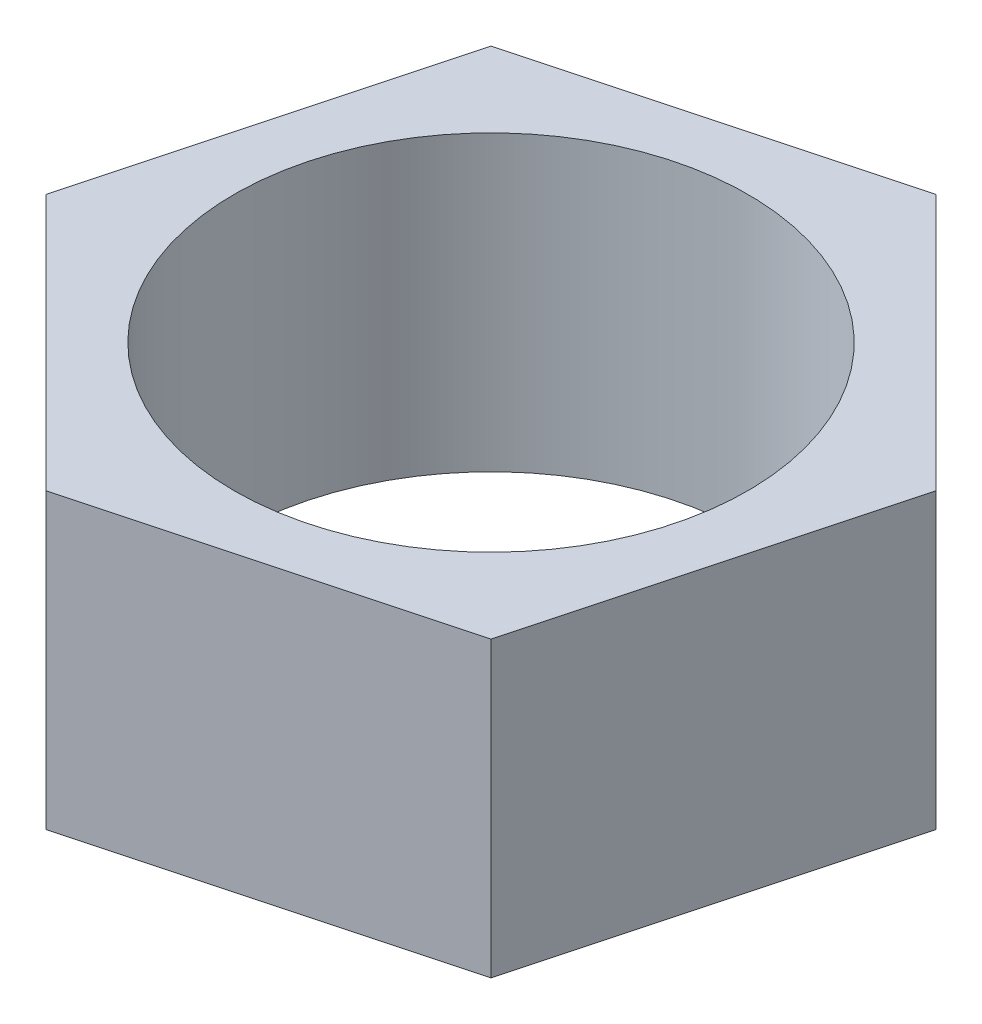
ISO-10303-21;
HEADER;
FILE_DESCRIPTION(('STEP AP214'),'2;1');
FILE_NAME('part.step','',(''),(''),'','','');
FILE_SCHEMA(('AUTOMOTIVE_DESIGN { 1 0 10303 214 1 1 1 1 }'));
ENDSEC;
DATA;
#1=APPLICATION_CONTEXT('core data for automotive mechanical design processes');
#2=APPLICATION_PROTOCOL_DEFINITION('international standard','automotive_design',2000,#1);
#3=PRODUCT_CONTEXT('',#1,'mechanical');
#4=PRODUCT('Part','Part','',(#3));
#5=PRODUCT_RELATED_PRODUCT_CATEGORY('part','',(#4));
#6=PRODUCT_DEFINITION_FORMATION('','',#4);
#7=PRODUCT_DEFINITION_CONTEXT('part definition',#1,'design');
#8=PRODUCT_DEFINITION('design','',#6,#7);
#9=PRODUCT_DEFINITION_SHAPE('','',#8);
#10=(LENGTH_UNIT() NAMED_UNIT(*) SI_UNIT(.MILLI.,.METRE.));
#11=(NAMED_UNIT(*) PLANE_ANGLE_UNIT() SI_UNIT($,.RADIAN.));
#12=(NAMED_UNIT(*) SI_UNIT($,.STERADIAN.) SOLID_ANGLE_UNIT());
#13=UNCERTAINTY_MEASURE_WITH_UNIT(LENGTH_MEASURE(1.E-05),#10,'distance_accuracy_value','');
#14=(GEOMETRIC_REPRESENTATION_CONTEXT(3) GLOBAL_UNCERTAINTY_ASSIGNED_CONTEXT((#13)) GLOBAL_UNIT_ASSIGNED_CONTEXT((#10,
#11,#12)) REPRESENTATION_CONTEXT('',''));
#15=CARTESIAN_POINT('',(0.,0.,0.));
#16=DIRECTION('',(0.,0.,1.));
#17=DIRECTION('',(1.,0.,0.));
#18=AXIS2_PLACEMENT_3D('',#15,#16,#17);
#19=CARTESIAN_POINT('',(0.,4.,0.));
#20=DIRECTION('',(0.,1.,0.));
#21=DIRECTION('',(0.,0.,1.));
#22=AXIS2_PLACEMENT_3D('',#19,#20,#21);
#23=PLANE('',#22);
#24=DIRECTION('',(0.965925826289066,0.,-0.258819045102529));
#25=VECTOR('',#24,1.);
#26=CARTESIAN_POINT('',(-1.28108891324549,4.,4.78108891324554));
#27=LINE('',#26,#25);
#28=CARTESIAN_POINT('',(-1.28108891324549,4.,4.78108891324554));
#29=VERTEX_POINT('',#28);
#30=CARTESIAN_POINT('',(3.50000000000003,4.,3.49999999999997));
#31=VERTEX_POINT('',#30);
#32=EDGE_CURVE('E133',#29,#31,#27,.T.);
#33=ORIENTED_EDGE('',*,*,#32,.T.);
#34=DIRECTION('',(0.258819045102513,0.,-0.96592582628907));
#35=VECTOR('',#34,1.);
#36=CARTESIAN_POINT('',(3.50000000000003,4.,3.49999999999997));
#37=LINE('',#36,#35);
#38=CARTESIAN_POINT('',(4.78108891324552,4.,-1.28108891324557));
#39=VERTEX_POINT('',#38);
#40=EDGE_CURVE('E91',#31,#39,#37,.T.);
#41=ORIENTED_EDGE('',*,*,#40,.T.);
#42=DIRECTION('',(-0.707106781186553,0.,-0.707106781186542));
#43=VECTOR('',#42,1.);
#44=CARTESIAN_POINT('',(4.78108891324552,4.,-1.28108891324557));
#45=LINE('',#44,#43);
#46=CARTESIAN_POINT('',(1.2810889132455,4.,-4.78108891324554));
#47=VERTEX_POINT('',#46);
#48=EDGE_CURVE('E104',#39,#47,#45,.T.);
#49=ORIENTED_EDGE('',*,*,#48,.T.);
#50=DIRECTION('',(-0.965925826289066,0.,0.258819045102529));
#51=VECTOR('',#50,1.);
#52=CARTESIAN_POINT('',(1.2810889132455,4.,-4.78108891324554));
#53=LINE('',#52,#51);
#54=CARTESIAN_POINT('',(-3.50000000000003,4.,-3.49999999999997));
#55=VERTEX_POINT('',#54);
#56=EDGE_CURVE('E98',#47,#55,#53,.T.);
#57=ORIENTED_EDGE('',*,*,#56,.T.);
#58=DIRECTION('',(-0.258819045102513,0.,0.965925826289071));
#59=VECTOR('',#58,1.);
#60=CARTESIAN_POINT('',(-3.50000000000003,4.,-3.49999999999997));
#61=LINE('',#60,#59);
#62=CARTESIAN_POINT('',(-4.78108891324552,4.,1.28108891324557));
#63=VERTEX_POINT('',#62);
#64=EDGE_CURVE('E102',#55,#63,#61,.T.);
#65=ORIENTED_EDGE('',*,*,#64,.T.);
#66=DIRECTION('',(0.707106781186553,0.,0.707106781186542));
#67=VECTOR('',#66,1.);
#68=CARTESIAN_POINT('',(-4.78108891324552,4.,1.28108891324557));
#69=LINE('',#68,#67);
#70=EDGE_CURVE('E54',#63,#29,#69,.T.);
#71=ORIENTED_EDGE('',*,*,#70,.T.);
#72=EDGE_LOOP('',(#33,#41,#49,#57,#65,#71));
#73=FACE_BOUND('',#72,.T.);
#74=CARTESIAN_POINT('',(0.,4.,0.));
#75=DIRECTION('',(0.,1.,0.));
#76=DIRECTION('',(0.,0.,1.));
#77=AXIS2_PLACEMENT_3D('',#74,#75,#76);
#78=CIRCLE('',#77,3.5);
#79=CARTESIAN_POINT('',(0.,4.,3.5));
#80=VERTEX_POINT('',#79);
#81=EDGE_CURVE('E126',#80,#80,#78,.T.);
#82=ORIENTED_EDGE('',*,*,#81,.F.);
#83=EDGE_LOOP('',(#82));
#84=FACE_BOUND('',#83,.T.);
#85=ADVANCED_FACE('F37',(#73,#84),#23,.T.);
#86=CARTESIAN_POINT('',(0.,0.,0.));
#87=DIRECTION('',(0.,1.,0.));
#88=DIRECTION('',(0.,0.,1.));
#89=AXIS2_PLACEMENT_3D('',#86,#87,#88);
#90=PLANE('',#89);
#91=DIRECTION('',(0.965925826289066,0.,-0.258819045102529));
#92=VECTOR('',#91,1.);
#93=CARTESIAN_POINT('',(-1.28108891324549,0.,4.78108891324554));
#94=LINE('',#93,#92);
#95=CARTESIAN_POINT('',(-1.28108891324549,0.,4.78108891324554));
#96=VERTEX_POINT('',#95);
#97=CARTESIAN_POINT('',(3.50000000000003,0.,3.49999999999997));
#98=VERTEX_POINT('',#97);
#99=EDGE_CURVE('E122',#96,#98,#94,.T.);
#100=ORIENTED_EDGE('',*,*,#99,.F.);
#101=DIRECTION('',(0.707106781186553,0.,0.707106781186542));
#102=VECTOR('',#101,1.);
#103=CARTESIAN_POINT('',(-4.78108891324552,0.,1.28108891324557));
#104=LINE('',#103,#102);
#105=CARTESIAN_POINT('',(-4.78108891324552,0.,1.28108891324557));
#106=VERTEX_POINT('',#105);
#107=EDGE_CURVE('E83',#106,#96,#104,.T.);
#108=ORIENTED_EDGE('',*,*,#107,.F.);
#109=DIRECTION('',(-0.258819045102513,0.,0.965925826289071));
#110=VECTOR('',#109,1.);
#111=CARTESIAN_POINT('',(-3.50000000000003,0.,-3.49999999999997));
#112=LINE('',#111,#110);
#113=CARTESIAN_POINT('',(-3.50000000000003,0.,-3.49999999999997));
#114=VERTEX_POINT('',#113);
#115=EDGE_CURVE('E77',#114,#106,#112,.T.);
#116=ORIENTED_EDGE('',*,*,#115,.F.);
#117=DIRECTION('',(-0.965925826289066,0.,0.258819045102529));
#118=VECTOR('',#117,1.);
#119=CARTESIAN_POINT('',(1.2810889132455,0.,-4.78108891324554));
#120=LINE('',#119,#118);
#121=CARTESIAN_POINT('',(1.2810889132455,0.,-4.78108891324554));
#122=VERTEX_POINT('',#121);
#123=EDGE_CURVE('E112',#122,#114,#120,.T.);
#124=ORIENTED_EDGE('',*,*,#123,.F.);
#125=DIRECTION('',(-0.707106781186553,0.,-0.707106781186542));
#126=VECTOR('',#125,1.);
#127=CARTESIAN_POINT('',(4.78108891324552,0.,-1.28108891324557));
#128=LINE('',#127,#126);
#129=CARTESIAN_POINT('',(4.78108891324552,0.,-1.28108891324557));
#130=VERTEX_POINT('',#129);
#131=EDGE_CURVE('E128',#130,#122,#128,.T.);
#132=ORIENTED_EDGE('',*,*,#131,.F.);
#133=DIRECTION('',(0.258819045102513,0.,-0.96592582628907));
#134=VECTOR('',#133,1.);
#135=CARTESIAN_POINT('',(3.50000000000003,0.,3.49999999999997));
#136=LINE('',#135,#134);
#137=EDGE_CURVE('E125',#98,#130,#136,.T.);
#138=ORIENTED_EDGE('',*,*,#137,.F.);
#139=EDGE_LOOP('',(#100,#108,#116,#124,#132,#138));
#140=FACE_BOUND('',#139,.T.);
#141=CARTESIAN_POINT('',(0.,0.,0.));
#142=DIRECTION('',(0.,1.,0.));
#143=DIRECTION('',(0.,0.,1.));
#144=AXIS2_PLACEMENT_3D('',#141,#142,#143);
#145=CIRCLE('',#144,3.5);
#146=CARTESIAN_POINT('',(0.,0.,3.5));
#147=VERTEX_POINT('',#146);
#148=EDGE_CURVE('E244',#147,#147,#145,.T.);
#149=ORIENTED_EDGE('',*,*,#148,.T.);
#150=EDGE_LOOP('',(#149));
#151=FACE_BOUND('',#150,.T.);
#152=ADVANCED_FACE('F142',(#140,#151),#90,.F.);
#153=CARTESIAN_POINT('',(-1.28108891324549,4.,4.78108891324554));
#154=DIRECTION('',(-0.258819045102529,0.,-0.965925826289066));
#155=DIRECTION('',(-0.965925826289066,0.,0.258819045102529));
#156=AXIS2_PLACEMENT_3D('',#153,#154,#155);
#157=PLANE('',#156);
#158=ORIENTED_EDGE('',*,*,#99,.T.);
#159=DIRECTION('',(0.,-1.,0.));
#160=VECTOR('',#159,1.);
#161=CARTESIAN_POINT('',(3.50000000000003,4.,3.49999999999997));
#162=LINE('',#161,#160);
#163=EDGE_CURVE('E11',#31,#98,#162,.T.);
#164=ORIENTED_EDGE('',*,*,#163,.F.);
#165=ORIENTED_EDGE('',*,*,#32,.F.);
#166=DIRECTION('',(0.,-1.,0.));
#167=VECTOR('',#166,1.);
#168=CARTESIAN_POINT('',(-1.28108891324549,4.,4.78108891324554));
#169=LINE('',#168,#167);
#170=EDGE_CURVE('E118',#29,#96,#169,.T.);
#171=ORIENTED_EDGE('',*,*,#170,.T.);
#172=EDGE_LOOP('',(#158,#164,#165,#171));
#173=FACE_BOUND('',#172,.T.);
#174=ADVANCED_FACE('F39',(#173),#157,.F.);
#175=CARTESIAN_POINT('',(3.50000000000003,4.,3.49999999999997));
#176=DIRECTION('',(-0.96592582628907,0.,-0.258819045102513));
#177=DIRECTION('',(-0.258819045102513,0.,0.96592582628907));
#178=AXIS2_PLACEMENT_3D('',#175,#176,#177);
#179=PLANE('',#178);
#180=ORIENTED_EDGE('',*,*,#137,.T.);
#181=DIRECTION('',(0.,-1.,0.));
#182=VECTOR('',#181,1.);
#183=CARTESIAN_POINT('',(4.78108891324552,4.,-1.28108891324557));
#184=LINE('',#183,#182);
#185=EDGE_CURVE('E46',#39,#130,#184,.T.);
#186=ORIENTED_EDGE('',*,*,#185,.F.);
#187=ORIENTED_EDGE('',*,*,#40,.F.);
#188=ORIENTED_EDGE('',*,*,#163,.T.);
#189=EDGE_LOOP('',(#180,#186,#187,#188));
#190=FACE_BOUND('',#189,.T.);
#191=ADVANCED_FACE('F167',(#190),#179,.F.);
#192=CARTESIAN_POINT('',(4.78108891324552,4.,-1.28108891324557));
#193=DIRECTION('',(-0.707106781186542,0.,0.707106781186553));
#194=DIRECTION('',(0.707106781186553,0.,0.707106781186542));
#195=AXIS2_PLACEMENT_3D('',#192,#193,#194);
#196=PLANE('',#195);
#197=ORIENTED_EDGE('',*,*,#131,.T.);
#198=DIRECTION('',(0.,-1.,0.));
#199=VECTOR('',#198,1.);
#200=CARTESIAN_POINT('',(1.2810889132455,4.,-4.78108891324554));
#201=LINE('',#200,#199);
#202=EDGE_CURVE('E113',#47,#122,#201,.T.);
#203=ORIENTED_EDGE('',*,*,#202,.F.);
#204=ORIENTED_EDGE('',*,*,#48,.F.);
#205=ORIENTED_EDGE('',*,*,#185,.T.);
#206=EDGE_LOOP('',(#197,#203,#204,#205));
#207=FACE_BOUND('',#206,.T.);
#208=ADVANCED_FACE('F139',(#207),#196,.F.);
#209=CARTESIAN_POINT('',(1.2810889132455,4.,-4.78108891324554));
#210=DIRECTION('',(0.258819045102529,0.,0.965925826289066));
#211=DIRECTION('',(0.965925826289066,0.,-0.258819045102529));
#212=AXIS2_PLACEMENT_3D('',#209,#210,#211);
#213=PLANE('',#212);
#214=ORIENTED_EDGE('',*,*,#123,.T.);
#215=DIRECTION('',(0.,-1.,0.));
#216=VECTOR('',#215,1.);
#217=CARTESIAN_POINT('',(-3.50000000000003,4.,-3.49999999999997));
#218=LINE('',#217,#216);
#219=EDGE_CURVE('E109',#55,#114,#218,.T.);
#220=ORIENTED_EDGE('',*,*,#219,.F.);
#221=ORIENTED_EDGE('',*,*,#56,.F.);
#222=ORIENTED_EDGE('',*,*,#202,.T.);
#223=EDGE_LOOP('',(#214,#220,#221,#222));
#224=FACE_BOUND('',#223,.T.);
#225=ADVANCED_FACE('F110',(#224),#213,.F.);
#226=CARTESIAN_POINT('',(-3.50000000000003,4.,-3.49999999999997));
#227=DIRECTION('',(0.965925826289071,0.,0.258819045102513));
#228=DIRECTION('',(0.258819045102513,0.,-0.965925826289071));
#229=AXIS2_PLACEMENT_3D('',#226,#227,#228);
#230=PLANE('',#229);
#231=ORIENTED_EDGE('',*,*,#115,.T.);
#232=DIRECTION('',(0.,-1.,0.));
#233=VECTOR('',#232,1.);
#234=CARTESIAN_POINT('',(-4.78108891324552,4.,1.28108891324557));
#235=LINE('',#234,#233);
#236=EDGE_CURVE('E114',#63,#106,#235,.T.);
#237=ORIENTED_EDGE('',*,*,#236,.F.);
#238=ORIENTED_EDGE('',*,*,#64,.F.);
#239=ORIENTED_EDGE('',*,*,#219,.T.);
#240=EDGE_LOOP('',(#231,#237,#238,#239));
#241=FACE_BOUND('',#240,.T.);
#242=ADVANCED_FACE('F116',(#241),#230,.F.);
#243=CARTESIAN_POINT('',(-4.78108891324552,4.,1.28108891324557));
#244=DIRECTION('',(0.707106781186542,0.,-0.707106781186553));
#245=DIRECTION('',(-0.707106781186553,0.,-0.707106781186542));
#246=AXIS2_PLACEMENT_3D('',#243,#244,#245);
#247=PLANE('',#246);
#248=ORIENTED_EDGE('',*,*,#107,.T.);
#249=ORIENTED_EDGE('',*,*,#170,.F.);
#250=ORIENTED_EDGE('',*,*,#70,.F.);
#251=ORIENTED_EDGE('',*,*,#236,.T.);
#252=EDGE_LOOP('',(#248,#249,#250,#251));
#253=FACE_BOUND('',#252,.T.);
#254=ADVANCED_FACE('F147',(#253),#247,.F.);
#255=CARTESIAN_POINT('',(0.,4.,0.));
#256=DIRECTION('',(0.,-1.,0.));
#257=DIRECTION('',(0.,0.,-1.));
#258=AXIS2_PLACEMENT_3D('',#255,#256,#257);
#259=CYLINDRICAL_SURFACE('',#258,3.5);
#260=ORIENTED_EDGE('',*,*,#81,.T.);
#261=EDGE_LOOP('',(#260));
#262=FACE_BOUND('',#261,.T.);
#263=ORIENTED_EDGE('',*,*,#148,.F.);
#264=EDGE_LOOP('',(#263));
#265=FACE_BOUND('',#264,.T.);
#266=ADVANCED_FACE('F149',(#262,#265),#259,.F.);
#267=CLOSED_SHELL('',(#85,#152,#174,#191,#208,#225,#242,#254,#266));
#268=MANIFOLD_SOLID_BREP('B2',#267);
#269=ADVANCED_BREP_SHAPE_REPRESENTATION('',(#18,#268),#14);
#270=SHAPE_DEFINITION_REPRESENTATION(#9,#269);
ENDSEC;
END-ISO-10303-21;
